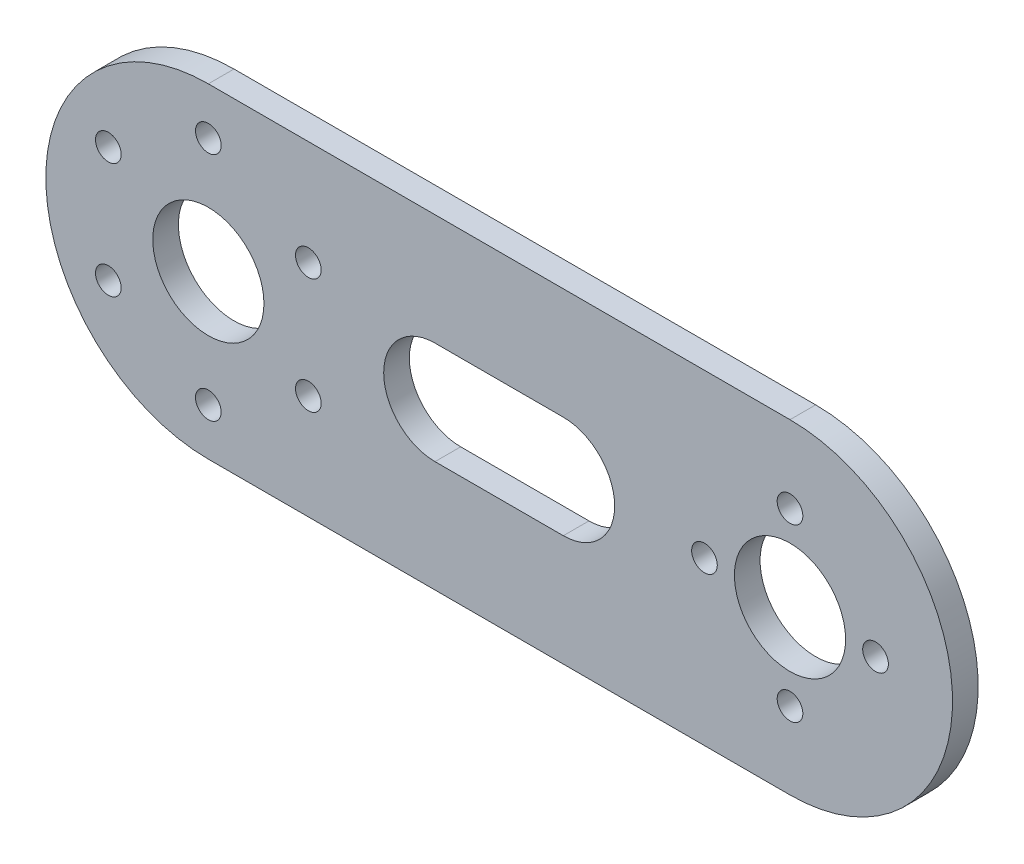
ISO-10303-21;
HEADER;
FILE_DESCRIPTION(('STEP AP214'),'2;1');
FILE_NAME('part.step','',(''),(''),'','','');
FILE_SCHEMA(('AUTOMOTIVE_DESIGN { 1 0 10303 214 1 1 1 1 }'));
ENDSEC;
DATA;
#1=APPLICATION_CONTEXT('core data for automotive mechanical design processes');
#2=APPLICATION_PROTOCOL_DEFINITION('international standard','automotive_design',2000,#1);
#3=PRODUCT_CONTEXT('',#1,'mechanical');
#4=PRODUCT('Part','Part','',(#3));
#5=PRODUCT_RELATED_PRODUCT_CATEGORY('part','',(#4));
#6=PRODUCT_DEFINITION_FORMATION('','',#4);
#7=PRODUCT_DEFINITION_CONTEXT('part definition',#1,'design');
#8=PRODUCT_DEFINITION('design','',#6,#7);
#9=PRODUCT_DEFINITION_SHAPE('','',#8);
#10=(LENGTH_UNIT() NAMED_UNIT(*) SI_UNIT(.MILLI.,.METRE.));
#11=(NAMED_UNIT(*) PLANE_ANGLE_UNIT() SI_UNIT($,.RADIAN.));
#12=(NAMED_UNIT(*) SI_UNIT($,.STERADIAN.) SOLID_ANGLE_UNIT());
#13=UNCERTAINTY_MEASURE_WITH_UNIT(LENGTH_MEASURE(1.E-05),#10,'distance_accuracy_value','');
#14=(GEOMETRIC_REPRESENTATION_CONTEXT(3) GLOBAL_UNCERTAINTY_ASSIGNED_CONTEXT((#13)) GLOBAL_UNIT_ASSIGNED_CONTEXT((#10,
#11,#12)) REPRESENTATION_CONTEXT('',''));
#15=CARTESIAN_POINT('',(0.,0.,0.));
#16=DIRECTION('',(0.,0.,1.));
#17=DIRECTION('',(1.,0.,0.));
#18=AXIS2_PLACEMENT_3D('',#15,#16,#17);
#19=CARTESIAN_POINT('',(0.,0.,3.));
#20=DIRECTION('',(0.,0.,-1.));
#21=DIRECTION('',(-1.,0.,0.));
#22=AXIS2_PLACEMENT_3D('',#19,#20,#21);
#23=CYLINDRICAL_SURFACE('',#22,19.);
#24=CARTESIAN_POINT('',(0.,0.,0.));
#25=DIRECTION('',(0.,0.,1.));
#26=DIRECTION('',(1.,0.,0.));
#27=AXIS2_PLACEMENT_3D('',#24,#25,#26);
#28=CIRCLE('',#27,19.);
#29=CARTESIAN_POINT('',(0.,19.,0.));
#30=VERTEX_POINT('',#29);
#31=CARTESIAN_POINT('',(0.,-19.,0.));
#32=VERTEX_POINT('',#31);
#33=EDGE_CURVE('E209',#30,#32,#28,.T.);
#34=ORIENTED_EDGE('',*,*,#33,.T.);
#35=DIRECTION('',(0.,0.,-1.));
#36=VECTOR('',#35,1.);
#37=CARTESIAN_POINT('',(0.,-19.,3.));
#38=LINE('',#37,#36);
#39=CARTESIAN_POINT('',(0.,-19.,3.));
#40=VERTEX_POINT('',#39);
#41=EDGE_CURVE('E11',#40,#32,#38,.T.);
#42=ORIENTED_EDGE('',*,*,#41,.F.);
#43=CARTESIAN_POINT('',(0.,0.,3.));
#44=DIRECTION('',(0.,0.,1.));
#45=DIRECTION('',(1.,0.,0.));
#46=AXIS2_PLACEMENT_3D('',#43,#44,#45);
#47=CIRCLE('',#46,19.);
#48=CARTESIAN_POINT('',(0.,19.,3.));
#49=VERTEX_POINT('',#48);
#50=EDGE_CURVE('E166',#49,#40,#47,.T.);
#51=ORIENTED_EDGE('',*,*,#50,.F.);
#52=DIRECTION('',(0.,0.,-1.));
#53=VECTOR('',#52,1.);
#54=CARTESIAN_POINT('',(0.,19.,3.));
#55=LINE('',#54,#53);
#56=EDGE_CURVE('E190',#49,#30,#55,.T.);
#57=ORIENTED_EDGE('',*,*,#56,.T.);
#58=EDGE_LOOP('',(#34,#42,#51,#57));
#59=FACE_BOUND('',#58,.T.);
#60=ADVANCED_FACE('F43',(#59),#23,.T.);
#61=CARTESIAN_POINT('',(0.,-19.,3.));
#62=DIRECTION('',(0.,-1.,0.));
#63=DIRECTION('',(1.,0.,0.));
#64=AXIS2_PLACEMENT_3D('',#61,#62,#63);
#65=PLANE('',#64);
#66=DIRECTION('',(-1.,0.,0.));
#67=VECTOR('',#66,1.);
#68=CARTESIAN_POINT('',(0.,-19.,0.));
#69=LINE('',#68,#67);
#70=CARTESIAN_POINT('',(68.,-19.,0.));
#71=VERTEX_POINT('',#70);
#72=EDGE_CURVE('E212',#71,#32,#69,.T.);
#73=ORIENTED_EDGE('',*,*,#72,.F.);
#74=DIRECTION('',(0.,0.,-1.));
#75=VECTOR('',#74,1.);
#76=CARTESIAN_POINT('',(68.,-19.,3.));
#77=LINE('',#76,#75);
#78=CARTESIAN_POINT('',(68.,-19.,3.));
#79=VERTEX_POINT('',#78);
#80=EDGE_CURVE('E51',#79,#71,#77,.T.);
#81=ORIENTED_EDGE('',*,*,#80,.F.);
#82=DIRECTION('',(-1.,0.,0.));
#83=VECTOR('',#82,1.);
#84=CARTESIAN_POINT('',(0.,-19.,3.));
#85=LINE('',#84,#83);
#86=EDGE_CURVE('E168',#79,#40,#85,.T.);
#87=ORIENTED_EDGE('',*,*,#86,.T.);
#88=ORIENTED_EDGE('',*,*,#41,.T.);
#89=EDGE_LOOP('',(#73,#81,#87,#88));
#90=FACE_BOUND('',#89,.T.);
#91=ADVANCED_FACE('F250',(#90),#65,.T.);
#92=CARTESIAN_POINT('',(68.,0.,3.));
#93=DIRECTION('',(0.,0.,-1.));
#94=DIRECTION('',(-1.,0.,0.));
#95=AXIS2_PLACEMENT_3D('',#92,#93,#94);
#96=CYLINDRICAL_SURFACE('',#95,19.);
#97=CARTESIAN_POINT('',(68.,0.,0.));
#98=DIRECTION('',(0.,0.,1.));
#99=DIRECTION('',(1.,0.,0.));
#100=AXIS2_PLACEMENT_3D('',#97,#98,#99);
#101=CIRCLE('',#100,19.);
#102=CARTESIAN_POINT('',(68.,19.,0.));
#103=VERTEX_POINT('',#102);
#104=EDGE_CURVE('E215',#71,#103,#101,.T.);
#105=ORIENTED_EDGE('',*,*,#104,.T.);
#106=DIRECTION('',(0.,0.,-1.));
#107=VECTOR('',#106,1.);
#108=CARTESIAN_POINT('',(68.,19.,3.));
#109=LINE('',#108,#107);
#110=CARTESIAN_POINT('',(68.,19.,3.));
#111=VERTEX_POINT('',#110);
#112=EDGE_CURVE('E236',#111,#103,#109,.T.);
#113=ORIENTED_EDGE('',*,*,#112,.F.);
#114=CARTESIAN_POINT('',(68.,0.,3.));
#115=DIRECTION('',(0.,0.,1.));
#116=DIRECTION('',(1.,0.,0.));
#117=AXIS2_PLACEMENT_3D('',#114,#115,#116);
#118=CIRCLE('',#117,19.);
#119=EDGE_CURVE('E171',#79,#111,#118,.T.);
#120=ORIENTED_EDGE('',*,*,#119,.F.);
#121=ORIENTED_EDGE('',*,*,#80,.T.);
#122=EDGE_LOOP('',(#105,#113,#120,#121));
#123=FACE_BOUND('',#122,.T.);
#124=ADVANCED_FACE('F240',(#123),#96,.T.);
#125=CARTESIAN_POINT('',(68.,-10.,3.));
#126=DIRECTION('',(0.,0.,-1.));
#127=DIRECTION('',(-1.,0.,0.));
#128=AXIS2_PLACEMENT_3D('',#125,#126,#127);
#129=CYLINDRICAL_SURFACE('',#128,1.50000000000001);
#130=CARTESIAN_POINT('',(68.,-10.,3.));
#131=DIRECTION('',(0.,0.,1.));
#132=DIRECTION('',(1.,0.,0.));
#133=AXIS2_PLACEMENT_3D('',#130,#131,#132);
#134=CIRCLE('',#133,1.50000000000001);
#135=CARTESIAN_POINT('',(69.5,-10.,3.));
#136=VERTEX_POINT('',#135);
#137=EDGE_CURVE('E185',#136,#136,#134,.T.);
#138=ORIENTED_EDGE('',*,*,#137,.T.);
#139=EDGE_LOOP('',(#138));
#140=FACE_BOUND('',#139,.T.);
#141=CARTESIAN_POINT('',(68.,-10.,0.));
#142=DIRECTION('',(0.,0.,1.));
#143=DIRECTION('',(1.,0.,0.));
#144=AXIS2_PLACEMENT_3D('',#141,#142,#143);
#145=CIRCLE('',#144,1.50000000000001);
#146=CARTESIAN_POINT('',(69.5,-10.,0.));
#147=VERTEX_POINT('',#146);
#148=EDGE_CURVE('E230',#147,#147,#145,.T.);
#149=ORIENTED_EDGE('',*,*,#148,.F.);
#150=EDGE_LOOP('',(#149));
#151=FACE_BOUND('',#150,.T.);
#152=ADVANCED_FACE('F500',(#140,#151),#129,.F.);
#153=CARTESIAN_POINT('',(78.,0.,3.));
#154=DIRECTION('',(0.,0.,-1.));
#155=DIRECTION('',(-1.,0.,0.));
#156=AXIS2_PLACEMENT_3D('',#153,#154,#155);
#157=CYLINDRICAL_SURFACE('',#156,1.5);
#158=CARTESIAN_POINT('',(78.,0.,3.));
#159=DIRECTION('',(0.,0.,1.));
#160=DIRECTION('',(1.,0.,0.));
#161=AXIS2_PLACEMENT_3D('',#158,#159,#160);
#162=CIRCLE('',#161,1.5);
#163=CARTESIAN_POINT('',(79.5,0.,3.));
#164=VERTEX_POINT('',#163);
#165=EDGE_CURVE('E182',#164,#164,#162,.T.);
#166=ORIENTED_EDGE('',*,*,#165,.T.);
#167=EDGE_LOOP('',(#166));
#168=FACE_BOUND('',#167,.T.);
#169=CARTESIAN_POINT('',(78.,0.,0.));
#170=DIRECTION('',(0.,0.,1.));
#171=DIRECTION('',(1.,0.,0.));
#172=AXIS2_PLACEMENT_3D('',#169,#170,#171);
#173=CIRCLE('',#172,1.5);
#174=CARTESIAN_POINT('',(79.5,0.,0.));
#175=VERTEX_POINT('',#174);
#176=EDGE_CURVE('E227',#175,#175,#173,.T.);
#177=ORIENTED_EDGE('',*,*,#176,.F.);
#178=EDGE_LOOP('',(#177));
#179=FACE_BOUND('',#178,.T.);
#180=ADVANCED_FACE('F490',(#168,#179),#157,.F.);
#181=CARTESIAN_POINT('',(68.,10.,3.));
#182=DIRECTION('',(0.,0.,-1.));
#183=DIRECTION('',(-1.,0.,0.));
#184=AXIS2_PLACEMENT_3D('',#181,#182,#183);
#185=CYLINDRICAL_SURFACE('',#184,1.5);
#186=CARTESIAN_POINT('',(68.,10.,3.));
#187=DIRECTION('',(0.,0.,1.));
#188=DIRECTION('',(1.,0.,0.));
#189=AXIS2_PLACEMENT_3D('',#186,#187,#188);
#190=CIRCLE('',#189,1.5);
#191=CARTESIAN_POINT('',(69.5,10.,3.));
#192=VERTEX_POINT('',#191);
#193=EDGE_CURVE('E179',#192,#192,#190,.T.);
#194=ORIENTED_EDGE('',*,*,#193,.T.);
#195=EDGE_LOOP('',(#194));
#196=FACE_BOUND('',#195,.T.);
#197=CARTESIAN_POINT('',(68.,10.,0.));
#198=DIRECTION('',(0.,0.,1.));
#199=DIRECTION('',(1.,0.,0.));
#200=AXIS2_PLACEMENT_3D('',#197,#198,#199);
#201=CIRCLE('',#200,1.5);
#202=CARTESIAN_POINT('',(69.5,10.,0.));
#203=VERTEX_POINT('',#202);
#204=EDGE_CURVE('E224',#203,#203,#201,.T.);
#205=ORIENTED_EDGE('',*,*,#204,.F.);
#206=EDGE_LOOP('',(#205));
#207=FACE_BOUND('',#206,.T.);
#208=ADVANCED_FACE('F480',(#196,#207),#185,.F.);
#209=CARTESIAN_POINT('',(68.,0.,3.));
#210=DIRECTION('',(0.,0.,-1.));
#211=DIRECTION('',(-1.,0.,0.));
#212=AXIS2_PLACEMENT_3D('',#209,#210,#211);
#213=CYLINDRICAL_SURFACE('',#212,6.5);
#214=CARTESIAN_POINT('',(68.,0.,3.));
#215=DIRECTION('',(0.,0.,1.));
#216=DIRECTION('',(1.,0.,0.));
#217=AXIS2_PLACEMENT_3D('',#214,#215,#216);
#218=CIRCLE('',#217,6.5);
#219=CARTESIAN_POINT('',(74.5,0.,3.));
#220=VERTEX_POINT('',#219);
#221=EDGE_CURVE('E176',#220,#220,#218,.T.);
#222=ORIENTED_EDGE('',*,*,#221,.T.);
#223=EDGE_LOOP('',(#222));
#224=FACE_BOUND('',#223,.T.);
#225=CARTESIAN_POINT('',(68.,0.,0.));
#226=DIRECTION('',(0.,0.,1.));
#227=DIRECTION('',(1.,0.,0.));
#228=AXIS2_PLACEMENT_3D('',#225,#226,#227);
#229=CIRCLE('',#228,6.5);
#230=CARTESIAN_POINT('',(74.5,0.,0.));
#231=VERTEX_POINT('',#230);
#232=EDGE_CURVE('E221',#231,#231,#229,.T.);
#233=ORIENTED_EDGE('',*,*,#232,.F.);
#234=EDGE_LOOP('',(#233));
#235=FACE_BOUND('',#234,.T.);
#236=ADVANCED_FACE('F471',(#224,#235),#213,.F.);
#237=CARTESIAN_POINT('',(0.,19.,3.));
#238=DIRECTION('',(0.,1.,0.));
#239=DIRECTION('',(0.,0.,1.));
#240=AXIS2_PLACEMENT_3D('',#237,#238,#239);
#241=PLANE('',#240);
#242=DIRECTION('',(1.,0.,0.));
#243=VECTOR('',#242,1.);
#244=CARTESIAN_POINT('',(0.,19.,0.));
#245=LINE('',#244,#243);
#246=EDGE_CURVE('E218',#30,#103,#245,.T.);
#247=ORIENTED_EDGE('',*,*,#246,.F.);
#248=ORIENTED_EDGE('',*,*,#56,.F.);
#249=DIRECTION('',(1.,0.,0.));
#250=VECTOR('',#249,1.);
#251=CARTESIAN_POINT('',(0.,19.,3.));
#252=LINE('',#251,#250);
#253=EDGE_CURVE('E173',#49,#111,#252,.T.);
#254=ORIENTED_EDGE('',*,*,#253,.T.);
#255=ORIENTED_EDGE('',*,*,#112,.T.);
#256=EDGE_LOOP('',(#247,#248,#254,#255));
#257=FACE_BOUND('',#256,.T.);
#258=ADVANCED_FACE('F255',(#257),#241,.T.);
#259=CARTESIAN_POINT('',(0.,0.,3.));
#260=DIRECTION('',(0.,0.,-1.));
#261=DIRECTION('',(-1.,0.,0.));
#262=AXIS2_PLACEMENT_3D('',#259,#260,#261);
#263=CYLINDRICAL_SURFACE('',#262,6.5);
#264=CARTESIAN_POINT('',(0.,0.,3.));
#265=DIRECTION('',(0.,0.,1.));
#266=DIRECTION('',(1.,0.,0.));
#267=AXIS2_PLACEMENT_3D('',#264,#265,#266);
#268=CIRCLE('',#267,6.5);
#269=CARTESIAN_POINT('',(6.5,0.,3.));
#270=VERTEX_POINT('',#269);
#271=EDGE_CURVE('E163',#270,#270,#268,.T.);
#272=ORIENTED_EDGE('',*,*,#271,.T.);
#273=EDGE_LOOP('',(#272));
#274=FACE_BOUND('',#273,.T.);
#275=CARTESIAN_POINT('',(0.,0.,0.));
#276=DIRECTION('',(0.,0.,1.));
#277=DIRECTION('',(1.,0.,0.));
#278=AXIS2_PLACEMENT_3D('',#275,#276,#277);
#279=CIRCLE('',#278,6.5);
#280=CARTESIAN_POINT('',(6.5,0.,0.));
#281=VERTEX_POINT('',#280);
#282=EDGE_CURVE('E206',#281,#281,#279,.T.);
#283=ORIENTED_EDGE('',*,*,#282,.F.);
#284=EDGE_LOOP('',(#283));
#285=FACE_BOUND('',#284,.T.);
#286=ADVANCED_FACE('F293',(#274,#285),#263,.F.);
#287=CARTESIAN_POINT('',(-11.6913429510899,6.75,3.));
#288=DIRECTION('',(0.,0.,-1.));
#289=DIRECTION('',(-1.,0.,0.));
#290=AXIS2_PLACEMENT_3D('',#287,#288,#289);
#291=CYLINDRICAL_SURFACE('',#290,1.5);
#292=CARTESIAN_POINT('',(-11.6913429510899,6.75,3.));
#293=DIRECTION('',(0.,0.,1.));
#294=DIRECTION('',(1.,0.,0.));
#295=AXIS2_PLACEMENT_3D('',#292,#293,#294);
#296=CIRCLE('',#295,1.5);
#297=CARTESIAN_POINT('',(-10.1913429510899,6.75,3.));
#298=VERTEX_POINT('',#297);
#299=EDGE_CURVE('E160',#298,#298,#296,.T.);
#300=ORIENTED_EDGE('',*,*,#299,.T.);
#301=EDGE_LOOP('',(#300));
#302=FACE_BOUND('',#301,.T.);
#303=CARTESIAN_POINT('',(-11.6913429510899,6.75,0.));
#304=DIRECTION('',(0.,0.,1.));
#305=DIRECTION('',(1.,0.,0.));
#306=AXIS2_PLACEMENT_3D('',#303,#304,#305);
#307=CIRCLE('',#306,1.5);
#308=CARTESIAN_POINT('',(-10.1913429510899,6.75,0.));
#309=VERTEX_POINT('',#308);
#310=EDGE_CURVE('E203',#309,#309,#307,.T.);
#311=ORIENTED_EDGE('',*,*,#310,.F.);
#312=EDGE_LOOP('',(#311));
#313=FACE_BOUND('',#312,.T.);
#314=ADVANCED_FACE('F296',(#302,#313),#291,.F.);
#315=CARTESIAN_POINT('',(-11.6913429510899,-6.75000000000001,3.));
#316=DIRECTION('',(0.,0.,-1.));
#317=DIRECTION('',(-1.,0.,0.));
#318=AXIS2_PLACEMENT_3D('',#315,#316,#317);
#319=CYLINDRICAL_SURFACE('',#318,1.5);
#320=CARTESIAN_POINT('',(-11.6913429510899,-6.75000000000001,3.));
#321=DIRECTION('',(0.,0.,1.));
#322=DIRECTION('',(1.,0.,0.));
#323=AXIS2_PLACEMENT_3D('',#320,#321,#322);
#324=CIRCLE('',#323,1.5);
#325=CARTESIAN_POINT('',(-10.1913429510899,-6.75000000000001,3.));
#326=VERTEX_POINT('',#325);
#327=EDGE_CURVE('E157',#326,#326,#324,.T.);
#328=ORIENTED_EDGE('',*,*,#327,.T.);
#329=EDGE_LOOP('',(#328));
#330=FACE_BOUND('',#329,.T.);
#331=CARTESIAN_POINT('',(-11.6913429510899,-6.75000000000001,0.));
#332=DIRECTION('',(0.,0.,1.));
#333=DIRECTION('',(1.,0.,0.));
#334=AXIS2_PLACEMENT_3D('',#331,#332,#333);
#335=CIRCLE('',#334,1.5);
#336=CARTESIAN_POINT('',(-10.1913429510899,-6.75000000000001,0.));
#337=VERTEX_POINT('',#336);
#338=EDGE_CURVE('E200',#337,#337,#335,.T.);
#339=ORIENTED_EDGE('',*,*,#338,.F.);
#340=EDGE_LOOP('',(#339));
#341=FACE_BOUND('',#340,.T.);
#342=ADVANCED_FACE('F300',(#330,#341),#319,.F.);
#343=CARTESIAN_POINT('',(0.,-13.5,3.));
#344=DIRECTION('',(0.,0.,-1.));
#345=DIRECTION('',(-1.,0.,0.));
#346=AXIS2_PLACEMENT_3D('',#343,#344,#345);
#347=CYLINDRICAL_SURFACE('',#346,1.5);
#348=CARTESIAN_POINT('',(0.,-13.5,3.));
#349=DIRECTION('',(0.,0.,1.));
#350=DIRECTION('',(1.,0.,0.));
#351=AXIS2_PLACEMENT_3D('',#348,#349,#350);
#352=CIRCLE('',#351,1.5);
#353=CARTESIAN_POINT('',(1.5,-13.5,3.));
#354=VERTEX_POINT('',#353);
#355=EDGE_CURVE('E154',#354,#354,#352,.T.);
#356=ORIENTED_EDGE('',*,*,#355,.T.);
#357=EDGE_LOOP('',(#356));
#358=FACE_BOUND('',#357,.T.);
#359=CARTESIAN_POINT('',(0.,-13.5,0.));
#360=DIRECTION('',(0.,0.,1.));
#361=DIRECTION('',(1.,0.,0.));
#362=AXIS2_PLACEMENT_3D('',#359,#360,#361);
#363=CIRCLE('',#362,1.5);
#364=CARTESIAN_POINT('',(1.5,-13.5,0.));
#365=VERTEX_POINT('',#364);
#366=EDGE_CURVE('E197',#365,#365,#363,.T.);
#367=ORIENTED_EDGE('',*,*,#366,.F.);
#368=EDGE_LOOP('',(#367));
#369=FACE_BOUND('',#368,.T.);
#370=ADVANCED_FACE('F304',(#358,#369),#347,.F.);
#371=CARTESIAN_POINT('',(11.6913429510899,-6.75,3.));
#372=DIRECTION('',(0.,0.,-1.));
#373=DIRECTION('',(-1.,0.,0.));
#374=AXIS2_PLACEMENT_3D('',#371,#372,#373);
#375=CYLINDRICAL_SURFACE('',#374,1.5);
#376=CARTESIAN_POINT('',(11.6913429510899,-6.75,3.));
#377=DIRECTION('',(0.,0.,1.));
#378=DIRECTION('',(1.,0.,0.));
#379=AXIS2_PLACEMENT_3D('',#376,#377,#378);
#380=CIRCLE('',#379,1.5);
#381=CARTESIAN_POINT('',(13.1913429510899,-6.75,3.));
#382=VERTEX_POINT('',#381);
#383=EDGE_CURVE('E151',#382,#382,#380,.T.);
#384=ORIENTED_EDGE('',*,*,#383,.T.);
#385=EDGE_LOOP('',(#384));
#386=FACE_BOUND('',#385,.T.);
#387=CARTESIAN_POINT('',(11.6913429510899,-6.75,0.));
#388=DIRECTION('',(0.,0.,1.));
#389=DIRECTION('',(1.,0.,0.));
#390=AXIS2_PLACEMENT_3D('',#387,#388,#389);
#391=CIRCLE('',#390,1.5);
#392=CARTESIAN_POINT('',(13.1913429510899,-6.75,0.));
#393=VERTEX_POINT('',#392);
#394=EDGE_CURVE('E194',#393,#393,#391,.T.);
#395=ORIENTED_EDGE('',*,*,#394,.F.);
#396=EDGE_LOOP('',(#395));
#397=FACE_BOUND('',#396,.T.);
#398=ADVANCED_FACE('F308',(#386,#397),#375,.F.);
#399=CARTESIAN_POINT('',(11.6913429510899,6.75,3.));
#400=DIRECTION('',(0.,0.,-1.));
#401=DIRECTION('',(-1.,0.,0.));
#402=AXIS2_PLACEMENT_3D('',#399,#400,#401);
#403=CYLINDRICAL_SURFACE('',#402,1.5);
#404=CARTESIAN_POINT('',(11.6913429510899,6.75,3.));
#405=DIRECTION('',(0.,0.,1.));
#406=DIRECTION('',(1.,0.,0.));
#407=AXIS2_PLACEMENT_3D('',#404,#405,#406);
#408=CIRCLE('',#407,1.5);
#409=CARTESIAN_POINT('',(13.1913429510899,6.75,3.));
#410=VERTEX_POINT('',#409);
#411=EDGE_CURVE('E147',#410,#410,#408,.T.);
#412=ORIENTED_EDGE('',*,*,#411,.T.);
#413=EDGE_LOOP('',(#412));
#414=FACE_BOUND('',#413,.T.);
#415=CARTESIAN_POINT('',(11.6913429510899,6.75,0.));
#416=DIRECTION('',(0.,0.,1.));
#417=DIRECTION('',(1.,0.,0.));
#418=AXIS2_PLACEMENT_3D('',#415,#416,#417);
#419=CIRCLE('',#418,1.5);
#420=CARTESIAN_POINT('',(13.1913429510899,6.75,0.));
#421=VERTEX_POINT('',#420);
#422=EDGE_CURVE('E131',#421,#421,#419,.T.);
#423=ORIENTED_EDGE('',*,*,#422,.F.);
#424=EDGE_LOOP('',(#423));
#425=FACE_BOUND('',#424,.T.);
#426=ADVANCED_FACE('F311',(#414,#425),#403,.F.);
#427=CARTESIAN_POINT('',(0.,13.5,3.));
#428=DIRECTION('',(0.,0.,-1.));
#429=DIRECTION('',(-1.,0.,0.));
#430=AXIS2_PLACEMENT_3D('',#427,#428,#429);
#431=CYLINDRICAL_SURFACE('',#430,1.5);
#432=CARTESIAN_POINT('',(0.,13.5,3.));
#433=DIRECTION('',(0.,0.,1.));
#434=DIRECTION('',(1.,0.,0.));
#435=AXIS2_PLACEMENT_3D('',#432,#433,#434);
#436=CIRCLE('',#435,1.5);
#437=CARTESIAN_POINT('',(1.5,13.5,3.));
#438=VERTEX_POINT('',#437);
#439=EDGE_CURVE('E144',#438,#438,#436,.T.);
#440=ORIENTED_EDGE('',*,*,#439,.T.);
#441=EDGE_LOOP('',(#440));
#442=FACE_BOUND('',#441,.T.);
#443=CARTESIAN_POINT('',(0.,13.5,0.));
#444=DIRECTION('',(0.,0.,1.));
#445=DIRECTION('',(1.,0.,0.));
#446=AXIS2_PLACEMENT_3D('',#443,#444,#445);
#447=CIRCLE('',#446,1.5);
#448=CARTESIAN_POINT('',(1.5,13.5,0.));
#449=VERTEX_POINT('',#448);
#450=EDGE_CURVE('E128',#449,#449,#447,.T.);
#451=ORIENTED_EDGE('',*,*,#450,.F.);
#452=EDGE_LOOP('',(#451));
#453=FACE_BOUND('',#452,.T.);
#454=ADVANCED_FACE('F45',(#442,#453),#431,.F.);
#455=CARTESIAN_POINT('',(58.,0.,3.));
#456=DIRECTION('',(0.,0.,-1.));
#457=DIRECTION('',(-1.,0.,0.));
#458=AXIS2_PLACEMENT_3D('',#455,#456,#457);
#459=CYLINDRICAL_SURFACE('',#458,1.50000000000001);
#460=CARTESIAN_POINT('',(58.,0.,3.));
#461=DIRECTION('',(0.,0.,1.));
#462=DIRECTION('',(1.,0.,0.));
#463=AXIS2_PLACEMENT_3D('',#460,#461,#462);
#464=CIRCLE('',#463,1.50000000000001);
#465=CARTESIAN_POINT('',(59.5,0.,3.));
#466=VERTEX_POINT('',#465);
#467=EDGE_CURVE('E188',#466,#466,#464,.T.);
#468=ORIENTED_EDGE('',*,*,#467,.T.);
#469=EDGE_LOOP('',(#468));
#470=FACE_BOUND('',#469,.T.);
#471=CARTESIAN_POINT('',(58.,0.,0.));
#472=DIRECTION('',(0.,0.,1.));
#473=DIRECTION('',(1.,0.,0.));
#474=AXIS2_PLACEMENT_3D('',#471,#472,#473);
#475=CIRCLE('',#474,1.50000000000001);
#476=CARTESIAN_POINT('',(59.5,0.,0.));
#477=VERTEX_POINT('',#476);
#478=EDGE_CURVE('E148',#477,#477,#475,.T.);
#479=ORIENTED_EDGE('',*,*,#478,.F.);
#480=EDGE_LOOP('',(#479));
#481=FACE_BOUND('',#480,.T.);
#482=ADVANCED_FACE('F260',(#470,#481),#459,.F.);
#483=CARTESIAN_POINT('',(0.,0.,3.));
#484=DIRECTION('',(0.,0.,1.));
#485=DIRECTION('',(1.,0.,0.));
#486=AXIS2_PLACEMENT_3D('',#483,#484,#485);
#487=PLANE('',#486);
#488=CARTESIAN_POINT('',(26.5,0.,3.));
#489=DIRECTION('',(0.,0.,1.));
#490=DIRECTION('',(1.,0.,0.));
#491=AXIS2_PLACEMENT_3D('',#488,#489,#490);
#492=CIRCLE('',#491,6.);
#493=CARTESIAN_POINT('',(26.5,6.,3.));
#494=VERTEX_POINT('',#493);
#495=CARTESIAN_POINT('',(26.5,-6.,3.));
#496=VERTEX_POINT('',#495);
#497=EDGE_CURVE('E58',#494,#496,#492,.T.);
#498=ORIENTED_EDGE('',*,*,#497,.F.);
#499=DIRECTION('',(-1.,0.,0.));
#500=VECTOR('',#499,1.);
#501=CARTESIAN_POINT('',(26.5,6.,3.));
#502=LINE('',#501,#500);
#503=CARTESIAN_POINT('',(41.5,6.,3.));
#504=VERTEX_POINT('',#503);
#505=EDGE_CURVE('E116',#504,#494,#502,.T.);
#506=ORIENTED_EDGE('',*,*,#505,.F.);
#507=CARTESIAN_POINT('',(41.5,0.,3.));
#508=DIRECTION('',(0.,0.,1.));
#509=DIRECTION('',(1.,0.,0.));
#510=AXIS2_PLACEMENT_3D('',#507,#508,#509);
#511=CIRCLE('',#510,6.);
#512=CARTESIAN_POINT('',(41.5,-6.,3.));
#513=VERTEX_POINT('',#512);
#514=EDGE_CURVE('E121',#513,#504,#511,.T.);
#515=ORIENTED_EDGE('',*,*,#514,.F.);
#516=DIRECTION('',(1.,0.,0.));
#517=VECTOR('',#516,1.);
#518=CARTESIAN_POINT('',(26.5,-6.,3.));
#519=LINE('',#518,#517);
#520=EDGE_CURVE('E127',#496,#513,#519,.T.);
#521=ORIENTED_EDGE('',*,*,#520,.F.);
#522=EDGE_LOOP('',(#498,#506,#515,#521));
#523=FACE_BOUND('',#522,.T.);
#524=ORIENTED_EDGE('',*,*,#439,.F.);
#525=EDGE_LOOP('',(#524));
#526=FACE_BOUND('',#525,.T.);
#527=ORIENTED_EDGE('',*,*,#411,.F.);
#528=EDGE_LOOP('',(#527));
#529=FACE_BOUND('',#528,.T.);
#530=ORIENTED_EDGE('',*,*,#383,.F.);
#531=EDGE_LOOP('',(#530));
#532=FACE_BOUND('',#531,.T.);
#533=ORIENTED_EDGE('',*,*,#355,.F.);
#534=EDGE_LOOP('',(#533));
#535=FACE_BOUND('',#534,.T.);
#536=ORIENTED_EDGE('',*,*,#327,.F.);
#537=EDGE_LOOP('',(#536));
#538=FACE_BOUND('',#537,.T.);
#539=ORIENTED_EDGE('',*,*,#299,.F.);
#540=EDGE_LOOP('',(#539));
#541=FACE_BOUND('',#540,.T.);
#542=ORIENTED_EDGE('',*,*,#271,.F.);
#543=EDGE_LOOP('',(#542));
#544=FACE_BOUND('',#543,.T.);
#545=ORIENTED_EDGE('',*,*,#50,.T.);
#546=ORIENTED_EDGE('',*,*,#86,.F.);
#547=ORIENTED_EDGE('',*,*,#119,.T.);
#548=ORIENTED_EDGE('',*,*,#253,.F.);
#549=EDGE_LOOP('',(#545,#546,#547,#548));
#550=FACE_BOUND('',#549,.T.);
#551=ORIENTED_EDGE('',*,*,#221,.F.);
#552=EDGE_LOOP('',(#551));
#553=FACE_BOUND('',#552,.T.);
#554=ORIENTED_EDGE('',*,*,#193,.F.);
#555=EDGE_LOOP('',(#554));
#556=FACE_BOUND('',#555,.T.);
#557=ORIENTED_EDGE('',*,*,#165,.F.);
#558=EDGE_LOOP('',(#557));
#559=FACE_BOUND('',#558,.T.);
#560=ORIENTED_EDGE('',*,*,#137,.F.);
#561=EDGE_LOOP('',(#560));
#562=FACE_BOUND('',#561,.T.);
#563=ORIENTED_EDGE('',*,*,#467,.F.);
#564=EDGE_LOOP('',(#563));
#565=FACE_BOUND('',#564,.T.);
#566=ADVANCED_FACE('F124',(#523,#526,#529,#532,#535,#538,#541,#544,#550,#553,#556,#559,#562,
#565),#487,.T.);
#567=CARTESIAN_POINT('',(0.,0.,0.));
#568=DIRECTION('',(0.,0.,1.));
#569=DIRECTION('',(1.,0.,0.));
#570=AXIS2_PLACEMENT_3D('',#567,#568,#569);
#571=PLANE('',#570);
#572=DIRECTION('',(-1.,0.,0.));
#573=VECTOR('',#572,1.);
#574=CARTESIAN_POINT('',(26.5,6.,0.));
#575=LINE('',#574,#573);
#576=CARTESIAN_POINT('',(41.5,6.,0.));
#577=VERTEX_POINT('',#576);
#578=CARTESIAN_POINT('',(26.5,6.,0.));
#579=VERTEX_POINT('',#578);
#580=EDGE_CURVE('E136',#577,#579,#575,.T.);
#581=ORIENTED_EDGE('',*,*,#580,.T.);
#582=CARTESIAN_POINT('',(26.5,0.,0.));
#583=DIRECTION('',(0.,0.,1.));
#584=DIRECTION('',(1.,0.,0.));
#585=AXIS2_PLACEMENT_3D('',#582,#583,#584);
#586=CIRCLE('',#585,6.);
#587=CARTESIAN_POINT('',(26.5,-6.,0.));
#588=VERTEX_POINT('',#587);
#589=EDGE_CURVE('E109',#579,#588,#586,.T.);
#590=ORIENTED_EDGE('',*,*,#589,.T.);
#591=DIRECTION('',(1.,0.,0.));
#592=VECTOR('',#591,1.);
#593=CARTESIAN_POINT('',(26.5,-6.,0.));
#594=LINE('',#593,#592);
#595=CARTESIAN_POINT('',(41.5,-6.,0.));
#596=VERTEX_POINT('',#595);
#597=EDGE_CURVE('E140',#588,#596,#594,.T.);
#598=ORIENTED_EDGE('',*,*,#597,.T.);
#599=CARTESIAN_POINT('',(41.5,0.,0.));
#600=DIRECTION('',(0.,0.,1.));
#601=DIRECTION('',(1.,0.,0.));
#602=AXIS2_PLACEMENT_3D('',#599,#600,#601);
#603=CIRCLE('',#602,6.);
#604=EDGE_CURVE('E66',#596,#577,#603,.T.);
#605=ORIENTED_EDGE('',*,*,#604,.T.);
#606=EDGE_LOOP('',(#581,#590,#598,#605));
#607=FACE_BOUND('',#606,.T.);
#608=ORIENTED_EDGE('',*,*,#450,.T.);
#609=EDGE_LOOP('',(#608));
#610=FACE_BOUND('',#609,.T.);
#611=ORIENTED_EDGE('',*,*,#422,.T.);
#612=EDGE_LOOP('',(#611));
#613=FACE_BOUND('',#612,.T.);
#614=ORIENTED_EDGE('',*,*,#394,.T.);
#615=EDGE_LOOP('',(#614));
#616=FACE_BOUND('',#615,.T.);
#617=ORIENTED_EDGE('',*,*,#366,.T.);
#618=EDGE_LOOP('',(#617));
#619=FACE_BOUND('',#618,.T.);
#620=ORIENTED_EDGE('',*,*,#338,.T.);
#621=EDGE_LOOP('',(#620));
#622=FACE_BOUND('',#621,.T.);
#623=ORIENTED_EDGE('',*,*,#310,.T.);
#624=EDGE_LOOP('',(#623));
#625=FACE_BOUND('',#624,.T.);
#626=ORIENTED_EDGE('',*,*,#282,.T.);
#627=EDGE_LOOP('',(#626));
#628=FACE_BOUND('',#627,.T.);
#629=ORIENTED_EDGE('',*,*,#33,.F.);
#630=ORIENTED_EDGE('',*,*,#246,.T.);
#631=ORIENTED_EDGE('',*,*,#104,.F.);
#632=ORIENTED_EDGE('',*,*,#72,.T.);
#633=EDGE_LOOP('',(#629,#630,#631,#632));
#634=FACE_BOUND('',#633,.T.);
#635=ORIENTED_EDGE('',*,*,#232,.T.);
#636=EDGE_LOOP('',(#635));
#637=FACE_BOUND('',#636,.T.);
#638=ORIENTED_EDGE('',*,*,#204,.T.);
#639=EDGE_LOOP('',(#638));
#640=FACE_BOUND('',#639,.T.);
#641=ORIENTED_EDGE('',*,*,#176,.T.);
#642=EDGE_LOOP('',(#641));
#643=FACE_BOUND('',#642,.T.);
#644=ORIENTED_EDGE('',*,*,#148,.T.);
#645=EDGE_LOOP('',(#644));
#646=FACE_BOUND('',#645,.T.);
#647=ORIENTED_EDGE('',*,*,#478,.T.);
#648=EDGE_LOOP('',(#647));
#649=FACE_BOUND('',#648,.T.);
#650=ADVANCED_FACE('F247',(#607,#610,#613,#616,#619,#622,#625,#628,#634,#637,#640,#643,#646,
#649),#571,.F.);
#651=CARTESIAN_POINT('',(26.5,0.,0.));
#652=DIRECTION('',(0.,0.,1.));
#653=DIRECTION('',(1.,0.,0.));
#654=AXIS2_PLACEMENT_3D('',#651,#652,#653);
#655=CYLINDRICAL_SURFACE('',#654,6.);
#656=ORIENTED_EDGE('',*,*,#497,.T.);
#657=DIRECTION('',(0.,0.,1.));
#658=VECTOR('',#657,1.);
#659=CARTESIAN_POINT('',(26.5,-6.,0.));
#660=LINE('',#659,#658);
#661=EDGE_CURVE('E138',#588,#496,#660,.T.);
#662=ORIENTED_EDGE('',*,*,#661,.F.);
#663=ORIENTED_EDGE('',*,*,#589,.F.);
#664=DIRECTION('',(0.,0.,1.));
#665=VECTOR('',#664,1.);
#666=CARTESIAN_POINT('',(26.5,6.,0.));
#667=LINE('',#666,#665);
#668=EDGE_CURVE('E105',#579,#494,#667,.T.);
#669=ORIENTED_EDGE('',*,*,#668,.T.);
#670=EDGE_LOOP('',(#656,#662,#663,#669));
#671=FACE_BOUND('',#670,.T.);
#672=ADVANCED_FACE('F107',(#671),#655,.F.);
#673=CARTESIAN_POINT('',(26.5,6.,0.));
#674=DIRECTION('',(0.,1.,0.));
#675=DIRECTION('',(-1.,0.,0.));
#676=AXIS2_PLACEMENT_3D('',#673,#674,#675);
#677=PLANE('',#676);
#678=ORIENTED_EDGE('',*,*,#505,.T.);
#679=ORIENTED_EDGE('',*,*,#668,.F.);
#680=ORIENTED_EDGE('',*,*,#580,.F.);
#681=DIRECTION('',(0.,0.,1.));
#682=VECTOR('',#681,1.);
#683=CARTESIAN_POINT('',(41.5,6.,0.));
#684=LINE('',#683,#682);
#685=EDGE_CURVE('E113',#577,#504,#684,.T.);
#686=ORIENTED_EDGE('',*,*,#685,.T.);
#687=EDGE_LOOP('',(#678,#679,#680,#686));
#688=FACE_BOUND('',#687,.T.);
#689=ADVANCED_FACE('F117',(#688),#677,.F.);
#690=CARTESIAN_POINT('',(41.5,0.,0.));
#691=DIRECTION('',(0.,0.,1.));
#692=DIRECTION('',(1.,0.,0.));
#693=AXIS2_PLACEMENT_3D('',#690,#691,#692);
#694=CYLINDRICAL_SURFACE('',#693,6.);
#695=ORIENTED_EDGE('',*,*,#514,.T.);
#696=ORIENTED_EDGE('',*,*,#685,.F.);
#697=ORIENTED_EDGE('',*,*,#604,.F.);
#698=DIRECTION('',(0.,0.,1.));
#699=VECTOR('',#698,1.);
#700=CARTESIAN_POINT('',(41.5,-6.,0.));
#701=LINE('',#700,#699);
#702=EDGE_CURVE('E574',#596,#513,#701,.T.);
#703=ORIENTED_EDGE('',*,*,#702,.T.);
#704=EDGE_LOOP('',(#695,#696,#697,#703));
#705=FACE_BOUND('',#704,.T.);
#706=ADVANCED_FACE('F385',(#705),#694,.F.);
#707=CARTESIAN_POINT('',(26.5,-6.,0.));
#708=DIRECTION('',(0.,-1.,0.));
#709=DIRECTION('',(1.,0.,0.));
#710=AXIS2_PLACEMENT_3D('',#707,#708,#709);
#711=PLANE('',#710);
#712=ORIENTED_EDGE('',*,*,#520,.T.);
#713=ORIENTED_EDGE('',*,*,#702,.F.);
#714=ORIENTED_EDGE('',*,*,#597,.F.);
#715=ORIENTED_EDGE('',*,*,#661,.T.);
#716=EDGE_LOOP('',(#712,#713,#714,#715));
#717=FACE_BOUND('',#716,.T.);
#718=ADVANCED_FACE('F395',(#717),#711,.F.);
#719=CLOSED_SHELL('',(#60,#91,#124,#152,#180,#208,#236,#258,#286,#314,#342,#370,#398,#426,#454,
#482,#566,#650,#672,#689,#706,#718));
#720=MANIFOLD_SOLID_BREP('B2',#719);
#721=ADVANCED_BREP_SHAPE_REPRESENTATION('',(#18,#720),#14);
#722=SHAPE_DEFINITION_REPRESENTATION(#9,#721);
ENDSEC;
END-ISO-10303-21;
